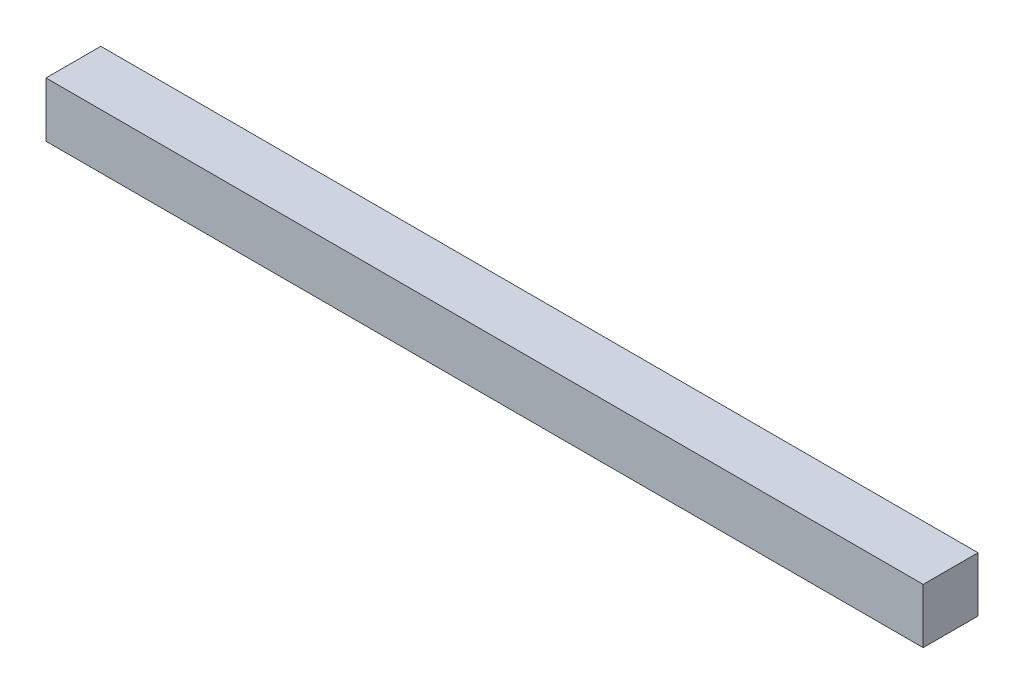
ISO-10303-21;
HEADER;
FILE_DESCRIPTION(('STEP AP214'),'2;1');
FILE_NAME('part.step','',(''),(''),'','','');
FILE_SCHEMA(('AUTOMOTIVE_DESIGN { 1 0 10303 214 1 1 1 1 }'));
ENDSEC;
DATA;
#1=APPLICATION_CONTEXT('core data for automotive mechanical design processes');
#2=APPLICATION_PROTOCOL_DEFINITION('international standard','automotive_design',2000,#1);
#3=PRODUCT_CONTEXT('',#1,'mechanical');
#4=PRODUCT('Part','Part','',(#3));
#5=PRODUCT_RELATED_PRODUCT_CATEGORY('part','',(#4));
#6=PRODUCT_DEFINITION_FORMATION('','',#4);
#7=PRODUCT_DEFINITION_CONTEXT('part definition',#1,'design');
#8=PRODUCT_DEFINITION('design','',#6,#7);
#9=PRODUCT_DEFINITION_SHAPE('','',#8);
#10=(LENGTH_UNIT() NAMED_UNIT(*) SI_UNIT(.MILLI.,.METRE.));
#11=(NAMED_UNIT(*) PLANE_ANGLE_UNIT() SI_UNIT($,.RADIAN.));
#12=(NAMED_UNIT(*) SI_UNIT($,.STERADIAN.) SOLID_ANGLE_UNIT());
#13=UNCERTAINTY_MEASURE_WITH_UNIT(LENGTH_MEASURE(1.E-05),#10,'distance_accuracy_value','');
#14=(GEOMETRIC_REPRESENTATION_CONTEXT(3) GLOBAL_UNCERTAINTY_ASSIGNED_CONTEXT((#13)) GLOBAL_UNIT_ASSIGNED_CONTEXT((#10,
#11,#12)) REPRESENTATION_CONTEXT('',''));
#15=CARTESIAN_POINT('',(0.,0.,0.));
#16=DIRECTION('',(0.,0.,1.));
#17=DIRECTION('',(1.,0.,0.));
#18=AXIS2_PLACEMENT_3D('',#15,#16,#17);
#19=CARTESIAN_POINT('',(80.,5.,-5.));
#20=DIRECTION('',(0.,0.,1.));
#21=DIRECTION('',(0.,-1.,0.));
#22=AXIS2_PLACEMENT_3D('',#19,#20,#21);
#23=PLANE('',#22);
#24=DIRECTION('',(0.,1.,0.));
#25=VECTOR('',#24,1.);
#26=CARTESIAN_POINT('',(-80.,5.,-5.));
#27=LINE('',#26,#25);
#28=CARTESIAN_POINT('',(-80.,-5.,-5.));
#29=VERTEX_POINT('',#28);
#30=CARTESIAN_POINT('',(-80.,5.,-5.));
#31=VERTEX_POINT('',#30);
#32=EDGE_CURVE('E96',#29,#31,#27,.T.);
#33=ORIENTED_EDGE('',*,*,#32,.T.);
#34=DIRECTION('',(-1.,0.,0.));
#35=VECTOR('',#34,1.);
#36=CARTESIAN_POINT('',(80.,5.,-5.));
#37=LINE('',#36,#35);
#38=CARTESIAN_POINT('',(80.,5.,-5.));
#39=VERTEX_POINT('',#38);
#40=EDGE_CURVE('E11',#39,#31,#37,.T.);
#41=ORIENTED_EDGE('',*,*,#40,.F.);
#42=DIRECTION('',(0.,1.,0.));
#43=VECTOR('',#42,1.);
#44=CARTESIAN_POINT('',(80.,5.,-5.));
#45=LINE('',#44,#43);
#46=CARTESIAN_POINT('',(80.,-5.,-5.));
#47=VERTEX_POINT('',#46);
#48=EDGE_CURVE('E84',#47,#39,#45,.T.);
#49=ORIENTED_EDGE('',*,*,#48,.F.);
#50=DIRECTION('',(-1.,0.,0.));
#51=VECTOR('',#50,1.);
#52=CARTESIAN_POINT('',(80.,-5.,-5.));
#53=LINE('',#52,#51);
#54=EDGE_CURVE('E92',#47,#29,#53,.T.);
#55=ORIENTED_EDGE('',*,*,#54,.T.);
#56=EDGE_LOOP('',(#33,#41,#49,#55));
#57=FACE_BOUND('',#56,.T.);
#58=ADVANCED_FACE('F33',(#57),#23,.F.);
#59=CARTESIAN_POINT('',(80.,5.,5.));
#60=DIRECTION('',(0.,-1.,0.));
#61=DIRECTION('',(0.,0.,-1.));
#62=AXIS2_PLACEMENT_3D('',#59,#60,#61);
#63=PLANE('',#62);
#64=DIRECTION('',(0.,0.,1.));
#65=VECTOR('',#64,1.);
#66=CARTESIAN_POINT('',(-80.,5.,5.));
#67=LINE('',#66,#65);
#68=CARTESIAN_POINT('',(-80.,5.,5.));
#69=VERTEX_POINT('',#68);
#70=EDGE_CURVE('E88',#31,#69,#67,.T.);
#71=ORIENTED_EDGE('',*,*,#70,.T.);
#72=DIRECTION('',(-1.,0.,0.));
#73=VECTOR('',#72,1.);
#74=CARTESIAN_POINT('',(80.,5.,5.));
#75=LINE('',#74,#73);
#76=CARTESIAN_POINT('',(80.,5.,5.));
#77=VERTEX_POINT('',#76);
#78=EDGE_CURVE('E41',#77,#69,#75,.T.);
#79=ORIENTED_EDGE('',*,*,#78,.F.);
#80=DIRECTION('',(0.,0.,1.));
#81=VECTOR('',#80,1.);
#82=CARTESIAN_POINT('',(80.,5.,5.));
#83=LINE('',#82,#81);
#84=EDGE_CURVE('E79',#39,#77,#83,.T.);
#85=ORIENTED_EDGE('',*,*,#84,.F.);
#86=ORIENTED_EDGE('',*,*,#40,.T.);
#87=EDGE_LOOP('',(#71,#79,#85,#86));
#88=FACE_BOUND('',#87,.T.);
#89=ADVANCED_FACE('F87',(#88),#63,.F.);
#90=CARTESIAN_POINT('',(80.,5.,5.));
#91=DIRECTION('',(0.,0.,-1.));
#92=DIRECTION('',(0.,1.,0.));
#93=AXIS2_PLACEMENT_3D('',#90,#91,#92);
#94=PLANE('',#93);
#95=DIRECTION('',(0.,-1.,0.));
#96=VECTOR('',#95,1.);
#97=CARTESIAN_POINT('',(-80.,5.,5.));
#98=LINE('',#97,#96);
#99=CARTESIAN_POINT('',(-80.,-5.,5.));
#100=VERTEX_POINT('',#99);
#101=EDGE_CURVE('E66',#69,#100,#98,.T.);
#102=ORIENTED_EDGE('',*,*,#101,.T.);
#103=DIRECTION('',(-1.,0.,0.));
#104=VECTOR('',#103,1.);
#105=CARTESIAN_POINT('',(80.,-5.,5.));
#106=LINE('',#105,#104);
#107=CARTESIAN_POINT('',(80.,-5.,5.));
#108=VERTEX_POINT('',#107);
#109=EDGE_CURVE('E89',#108,#100,#106,.T.);
#110=ORIENTED_EDGE('',*,*,#109,.F.);
#111=DIRECTION('',(0.,-1.,0.));
#112=VECTOR('',#111,1.);
#113=CARTESIAN_POINT('',(80.,5.,5.));
#114=LINE('',#113,#112);
#115=EDGE_CURVE('E82',#77,#108,#114,.T.);
#116=ORIENTED_EDGE('',*,*,#115,.F.);
#117=ORIENTED_EDGE('',*,*,#78,.T.);
#118=EDGE_LOOP('',(#102,#110,#116,#117));
#119=FACE_BOUND('',#118,.T.);
#120=ADVANCED_FACE('F90',(#119),#94,.F.);
#121=CARTESIAN_POINT('',(80.,-5.,5.));
#122=DIRECTION('',(0.,1.,0.));
#123=DIRECTION('',(0.,0.,1.));
#124=AXIS2_PLACEMENT_3D('',#121,#122,#123);
#125=PLANE('',#124);
#126=DIRECTION('',(0.,0.,-1.));
#127=VECTOR('',#126,1.);
#128=CARTESIAN_POINT('',(-80.,-5.,5.));
#129=LINE('',#128,#127);
#130=EDGE_CURVE('E72',#100,#29,#129,.T.);
#131=ORIENTED_EDGE('',*,*,#130,.T.);
#132=ORIENTED_EDGE('',*,*,#54,.F.);
#133=DIRECTION('',(0.,0.,-1.));
#134=VECTOR('',#133,1.);
#135=CARTESIAN_POINT('',(80.,-5.,5.));
#136=LINE('',#135,#134);
#137=EDGE_CURVE('E49',#108,#47,#136,.T.);
#138=ORIENTED_EDGE('',*,*,#137,.F.);
#139=ORIENTED_EDGE('',*,*,#109,.T.);
#140=EDGE_LOOP('',(#131,#132,#138,#139));
#141=FACE_BOUND('',#140,.T.);
#142=ADVANCED_FACE('F103',(#141),#125,.F.);
#143=CARTESIAN_POINT('',(80.,0.,0.));
#144=DIRECTION('',(1.,0.,0.));
#145=DIRECTION('',(0.,0.,-1.));
#146=AXIS2_PLACEMENT_3D('',#143,#144,#145);
#147=PLANE('',#146);
#148=ORIENTED_EDGE('',*,*,#48,.T.);
#149=ORIENTED_EDGE('',*,*,#84,.T.);
#150=ORIENTED_EDGE('',*,*,#115,.T.);
#151=ORIENTED_EDGE('',*,*,#137,.T.);
#152=EDGE_LOOP('',(#148,#149,#150,#151));
#153=FACE_BOUND('',#152,.T.);
#154=ADVANCED_FACE('F80',(#153),#147,.T.);
#155=CARTESIAN_POINT('',(-80.,0.,0.));
#156=DIRECTION('',(1.,0.,0.));
#157=DIRECTION('',(0.,0.,-1.));
#158=AXIS2_PLACEMENT_3D('',#155,#156,#157);
#159=PLANE('',#158);
#160=ORIENTED_EDGE('',*,*,#32,.F.);
#161=ORIENTED_EDGE('',*,*,#130,.F.);
#162=ORIENTED_EDGE('',*,*,#101,.F.);
#163=ORIENTED_EDGE('',*,*,#70,.F.);
#164=EDGE_LOOP('',(#160,#161,#162,#163));
#165=FACE_BOUND('',#164,.T.);
#166=ADVANCED_FACE('F106',(#165),#159,.F.);
#167=CLOSED_SHELL('',(#58,#89,#120,#142,#154,#166));
#168=MANIFOLD_SOLID_BREP('B2',#167);
#169=ADVANCED_BREP_SHAPE_REPRESENTATION('',(#18,#168),#14);
#170=SHAPE_DEFINITION_REPRESENTATION(#9,#169);
ENDSEC;
END-ISO-10303-21;
